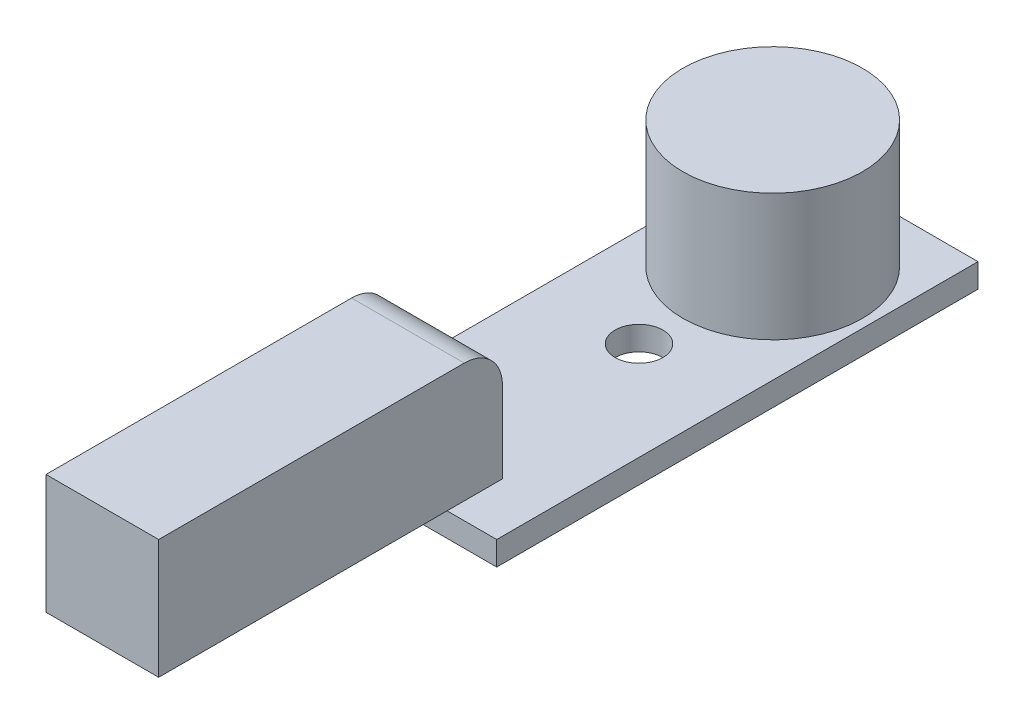
ISO-10303-21;
HEADER;
FILE_DESCRIPTION(('STEP AP214'),'2;1');
FILE_NAME('part.step','',(''),(''),'','','');
FILE_SCHEMA(('AUTOMOTIVE_DESIGN { 1 0 10303 214 1 1 1 1 }'));
ENDSEC;
DATA;
#1=APPLICATION_CONTEXT('core data for automotive mechanical design processes');
#2=APPLICATION_PROTOCOL_DEFINITION('international standard','automotive_design',2000,#1);
#3=PRODUCT_CONTEXT('',#1,'mechanical');
#4=PRODUCT('Part','Part','',(#3));
#5=PRODUCT_RELATED_PRODUCT_CATEGORY('part','',(#4));
#6=PRODUCT_DEFINITION_FORMATION('','',#4);
#7=PRODUCT_DEFINITION_CONTEXT('part definition',#1,'design');
#8=PRODUCT_DEFINITION('design','',#6,#7);
#9=PRODUCT_DEFINITION_SHAPE('','',#8);
#10=(LENGTH_UNIT() NAMED_UNIT(*) SI_UNIT(.MILLI.,.METRE.));
#11=(NAMED_UNIT(*) PLANE_ANGLE_UNIT() SI_UNIT($,.RADIAN.));
#12=(NAMED_UNIT(*) SI_UNIT($,.STERADIAN.) SOLID_ANGLE_UNIT());
#13=UNCERTAINTY_MEASURE_WITH_UNIT(LENGTH_MEASURE(1.E-05),#10,'distance_accuracy_value','');
#14=(GEOMETRIC_REPRESENTATION_CONTEXT(3) GLOBAL_UNCERTAINTY_ASSIGNED_CONTEXT((#13)) GLOBAL_UNIT_ASSIGNED_CONTEXT((#10,
#11,#12)) REPRESENTATION_CONTEXT('',''));
#15=CARTESIAN_POINT('',(0.,0.,0.));
#16=DIRECTION('',(0.,0.,1.));
#17=DIRECTION('',(1.,0.,0.));
#18=AXIS2_PLACEMENT_3D('',#15,#16,#17);
#19=CARTESIAN_POINT('',(0.,1.5875,16.002));
#20=DIRECTION('',(0.,0.,-1.));
#21=DIRECTION('',(-1.,0.,0.));
#22=AXIS2_PLACEMENT_3D('',#19,#20,#21);
#23=PLANE('',#22);
#24=DIRECTION('',(1.,0.,0.));
#25=VECTOR('',#24,1.);
#26=CARTESIAN_POINT('',(0.,0.,16.002));
#27=LINE('',#26,#25);
#28=CARTESIAN_POINT('',(-6.5405,0.,16.002));
#29=VERTEX_POINT('',#28);
#30=CARTESIAN_POINT('',(6.5405,0.,16.002));
#31=VERTEX_POINT('',#30);
#32=EDGE_CURVE('E188',#29,#31,#27,.T.);
#33=ORIENTED_EDGE('',*,*,#32,.T.);
#34=DIRECTION('',(0.,-1.,0.));
#35=VECTOR('',#34,1.);
#36=CARTESIAN_POINT('',(6.5405,1.5875,16.002));
#37=LINE('',#36,#35);
#38=CARTESIAN_POINT('',(6.5405,1.5875,16.002));
#39=VERTEX_POINT('',#38);
#40=EDGE_CURVE('E162',#39,#31,#37,.T.);
#41=ORIENTED_EDGE('',*,*,#40,.F.);
#42=DIRECTION('',(1.,0.,0.));
#43=VECTOR('',#42,1.);
#44=CARTESIAN_POINT('',(0.,1.5875,16.002));
#45=LINE('',#44,#43);
#46=CARTESIAN_POINT('',(3.23850000000001,1.5875,16.002));
#47=VERTEX_POINT('',#46);
#48=EDGE_CURVE('E169',#47,#39,#45,.T.);
#49=ORIENTED_EDGE('',*,*,#48,.F.);
#50=CARTESIAN_POINT('',(-4.2545,1.5875,16.002));
#51=VERTEX_POINT('',#50);
#52=EDGE_CURVE('E173',#51,#47,#45,.T.);
#53=ORIENTED_EDGE('',*,*,#52,.F.);
#54=CARTESIAN_POINT('',(-6.5405,1.5875,16.002));
#55=VERTEX_POINT('',#54);
#56=EDGE_CURVE('E168',#55,#51,#45,.T.);
#57=ORIENTED_EDGE('',*,*,#56,.F.);
#58=DIRECTION('',(0.,-1.,0.));
#59=VECTOR('',#58,1.);
#60=CARTESIAN_POINT('',(-6.5405,1.5875,16.002));
#61=LINE('',#60,#59);
#62=EDGE_CURVE('E187',#55,#29,#61,.T.);
#63=ORIENTED_EDGE('',*,*,#62,.T.);
#64=EDGE_LOOP('',(#33,#41,#49,#53,#57,#63));
#65=FACE_BOUND('',#64,.T.);
#66=ADVANCED_FACE('F44',(#65),#23,.F.);
#67=CARTESIAN_POINT('',(6.5405,1.5875,0.));
#68=DIRECTION('',(-1.,0.,0.));
#69=DIRECTION('',(0.,0.,1.));
#70=AXIS2_PLACEMENT_3D('',#67,#68,#69);
#71=PLANE('',#70);
#72=DIRECTION('',(0.,0.,-1.));
#73=VECTOR('',#72,1.);
#74=CARTESIAN_POINT('',(6.5405,0.,0.));
#75=LINE('',#74,#73);
#76=CARTESIAN_POINT('',(6.5405,0.,-16.002));
#77=VERTEX_POINT('',#76);
#78=EDGE_CURVE('E192',#31,#77,#75,.T.);
#79=ORIENTED_EDGE('',*,*,#78,.T.);
#80=DIRECTION('',(0.,-1.,0.));
#81=VECTOR('',#80,1.);
#82=CARTESIAN_POINT('',(6.5405,1.5875,-16.002));
#83=LINE('',#82,#81);
#84=CARTESIAN_POINT('',(6.5405,1.5875,-16.002));
#85=VERTEX_POINT('',#84);
#86=EDGE_CURVE('E209',#85,#77,#83,.T.);
#87=ORIENTED_EDGE('',*,*,#86,.F.);
#88=DIRECTION('',(0.,0.,-1.));
#89=VECTOR('',#88,1.);
#90=CARTESIAN_POINT('',(6.5405,1.5875,0.));
#91=LINE('',#90,#89);
#92=EDGE_CURVE('E171',#39,#85,#91,.T.);
#93=ORIENTED_EDGE('',*,*,#92,.F.);
#94=ORIENTED_EDGE('',*,*,#40,.T.);
#95=EDGE_LOOP('',(#79,#87,#93,#94));
#96=FACE_BOUND('',#95,.T.);
#97=ADVANCED_FACE('F238',(#96),#71,.F.);
#98=CARTESIAN_POINT('',(0.,1.5875,-16.002));
#99=DIRECTION('',(0.,0.,-1.));
#100=DIRECTION('',(-1.,0.,0.));
#101=AXIS2_PLACEMENT_3D('',#98,#99,#100);
#102=PLANE('',#101);
#103=DIRECTION('',(1.,0.,0.));
#104=VECTOR('',#103,1.);
#105=CARTESIAN_POINT('',(0.,0.,-16.002));
#106=LINE('',#105,#104);
#107=CARTESIAN_POINT('',(-6.5405,0.,-16.002));
#108=VERTEX_POINT('',#107);
#109=EDGE_CURVE('E196',#108,#77,#106,.T.);
#110=ORIENTED_EDGE('',*,*,#109,.F.);
#111=DIRECTION('',(0.,-1.,0.));
#112=VECTOR('',#111,1.);
#113=CARTESIAN_POINT('',(-6.5405,1.5875,-16.002));
#114=LINE('',#113,#112);
#115=CARTESIAN_POINT('',(-6.5405,1.5875,-16.002));
#116=VERTEX_POINT('',#115);
#117=EDGE_CURVE('E210',#116,#108,#114,.T.);
#118=ORIENTED_EDGE('',*,*,#117,.F.);
#119=DIRECTION('',(1.,0.,0.));
#120=VECTOR('',#119,1.);
#121=CARTESIAN_POINT('',(0.,1.5875,-16.002));
#122=LINE('',#121,#120);
#123=EDGE_CURVE('E176',#116,#85,#122,.T.);
#124=ORIENTED_EDGE('',*,*,#123,.T.);
#125=ORIENTED_EDGE('',*,*,#86,.T.);
#126=EDGE_LOOP('',(#110,#118,#124,#125));
#127=FACE_BOUND('',#126,.T.);
#128=ADVANCED_FACE('F253',(#127),#102,.T.);
#129=CARTESIAN_POINT('',(0.,1.5875,0.));
#130=DIRECTION('',(0.,-1.,0.));
#131=DIRECTION('',(0.,0.,-1.));
#132=AXIS2_PLACEMENT_3D('',#129,#130,#131);
#133=CYLINDRICAL_SURFACE('',#132,1.5875);
#134=CARTESIAN_POINT('',(0.,1.5875,0.));
#135=DIRECTION('',(0.,1.,0.));
#136=DIRECTION('',(0.,0.,1.));
#137=AXIS2_PLACEMENT_3D('',#134,#135,#136);
#138=CIRCLE('',#137,1.5875);
#139=CARTESIAN_POINT('',(0.,1.5875,1.5875));
#140=VERTEX_POINT('',#139);
#141=EDGE_CURVE('E163',#140,#140,#138,.T.);
#142=ORIENTED_EDGE('',*,*,#141,.T.);
#143=EDGE_LOOP('',(#142));
#144=FACE_BOUND('',#143,.T.);
#145=CARTESIAN_POINT('',(0.,0.,0.));
#146=DIRECTION('',(0.,1.,0.));
#147=DIRECTION('',(0.,0.,1.));
#148=AXIS2_PLACEMENT_3D('',#145,#146,#147);
#149=CIRCLE('',#148,1.5875);
#150=CARTESIAN_POINT('',(0.,0.,1.5875));
#151=VERTEX_POINT('',#150);
#152=EDGE_CURVE('E155',#151,#151,#149,.T.);
#153=ORIENTED_EDGE('',*,*,#152,.F.);
#154=EDGE_LOOP('',(#153));
#155=FACE_BOUND('',#154,.T.);
#156=ADVANCED_FACE('F286',(#144,#155),#133,.F.);
#157=CARTESIAN_POINT('',(-6.5405,1.5875,0.));
#158=DIRECTION('',(-1.,0.,0.));
#159=DIRECTION('',(0.,0.,1.));
#160=AXIS2_PLACEMENT_3D('',#157,#158,#159);
#161=PLANE('',#160);
#162=DIRECTION('',(0.,0.,-1.));
#163=VECTOR('',#162,1.);
#164=CARTESIAN_POINT('',(-6.5405,0.,0.));
#165=LINE('',#164,#163);
#166=EDGE_CURVE('E166',#29,#108,#165,.T.);
#167=ORIENTED_EDGE('',*,*,#166,.F.);
#168=ORIENTED_EDGE('',*,*,#62,.F.);
#169=DIRECTION('',(0.,0.,-1.));
#170=VECTOR('',#169,1.);
#171=CARTESIAN_POINT('',(-6.5405,1.5875,0.));
#172=LINE('',#171,#170);
#173=EDGE_CURVE('E185',#55,#116,#172,.T.);
#174=ORIENTED_EDGE('',*,*,#173,.T.);
#175=ORIENTED_EDGE('',*,*,#117,.T.);
#176=EDGE_LOOP('',(#167,#168,#174,#175));
#177=FACE_BOUND('',#176,.T.);
#178=ADVANCED_FACE('F250',(#177),#161,.T.);
#179=CARTESIAN_POINT('',(0.,1.5875,0.));
#180=DIRECTION('',(0.,1.,0.));
#181=DIRECTION('',(0.,0.,1.));
#182=AXIS2_PLACEMENT_3D('',#179,#180,#181);
#183=PLANE('',#182);
#184=DIRECTION('',(0.,0.,1.));
#185=VECTOR('',#184,1.);
#186=CARTESIAN_POINT('',(-4.2545,1.5875,12.319));
#187=LINE('',#186,#185);
#188=CARTESIAN_POINT('',(-4.2545,1.5875,12.319));
#189=VERTEX_POINT('',#188);
#190=EDGE_CURVE('E252',#189,#51,#187,.T.);
#191=ORIENTED_EDGE('',*,*,#190,.F.);
#192=DIRECTION('',(-1.,0.,0.));
#193=VECTOR('',#192,1.);
#194=CARTESIAN_POINT('',(-4.2545,1.5875,12.319));
#195=LINE('',#194,#193);
#196=CARTESIAN_POINT('',(3.2385,1.5875,12.319));
#197=VERTEX_POINT('',#196);
#198=EDGE_CURVE('E128',#197,#189,#195,.T.);
#199=ORIENTED_EDGE('',*,*,#198,.F.);
#200=DIRECTION('',(0.,0.,-1.));
#201=VECTOR('',#200,1.);
#202=CARTESIAN_POINT('',(3.2385,1.5875,12.319));
#203=LINE('',#202,#201);
#204=EDGE_CURVE('E165',#47,#197,#203,.T.);
#205=ORIENTED_EDGE('',*,*,#204,.F.);
#206=ORIENTED_EDGE('',*,*,#48,.T.);
#207=ORIENTED_EDGE('',*,*,#92,.T.);
#208=ORIENTED_EDGE('',*,*,#123,.F.);
#209=ORIENTED_EDGE('',*,*,#173,.F.);
#210=ORIENTED_EDGE('',*,*,#56,.T.);
#211=EDGE_LOOP('',(#191,#199,#205,#206,#207,#208,#209,#210));
#212=FACE_BOUND('',#211,.T.);
#213=CARTESIAN_POINT('',(0.,1.5875,-8.89));
#214=DIRECTION('',(0.,1.,0.));
#215=DIRECTION('',(0.,0.,1.));
#216=AXIS2_PLACEMENT_3D('',#213,#214,#215);
#217=CIRCLE('',#216,5.969);
#218=CARTESIAN_POINT('',(0.,1.5875,-2.921));
#219=VERTEX_POINT('',#218);
#220=EDGE_CURVE('E158',#219,#219,#217,.T.);
#221=ORIENTED_EDGE('',*,*,#220,.F.);
#222=EDGE_LOOP('',(#221));
#223=FACE_BOUND('',#222,.T.);
#224=ORIENTED_EDGE('',*,*,#141,.F.);
#225=EDGE_LOOP('',(#224));
#226=FACE_BOUND('',#225,.T.);
#227=ADVANCED_FACE('F233',(#212,#223,#226),#183,.T.);
#228=CARTESIAN_POINT('',(0.,0.,0.));
#229=DIRECTION('',(0.,1.,0.));
#230=DIRECTION('',(0.,0.,1.));
#231=AXIS2_PLACEMENT_3D('',#228,#229,#230);
#232=PLANE('',#231);
#233=ORIENTED_EDGE('',*,*,#152,.T.);
#234=EDGE_LOOP('',(#233));
#235=FACE_BOUND('',#234,.T.);
#236=ORIENTED_EDGE('',*,*,#32,.F.);
#237=ORIENTED_EDGE('',*,*,#166,.T.);
#238=ORIENTED_EDGE('',*,*,#109,.T.);
#239=ORIENTED_EDGE('',*,*,#78,.F.);
#240=EDGE_LOOP('',(#236,#237,#238,#239));
#241=FACE_BOUND('',#240,.T.);
#242=ADVANCED_FACE('F243',(#235,#241),#232,.F.);
#243=CARTESIAN_POINT('',(0.,10.033,-8.89));
#244=DIRECTION('',(0.,-1.,0.));
#245=DIRECTION('',(0.,0.,-1.));
#246=AXIS2_PLACEMENT_3D('',#243,#244,#245);
#247=CYLINDRICAL_SURFACE('',#246,5.969);
#248=CARTESIAN_POINT('',(0.,10.033,-8.89));
#249=DIRECTION('',(0.,1.,0.));
#250=DIRECTION('',(0.,0.,1.));
#251=AXIS2_PLACEMENT_3D('',#248,#249,#250);
#252=CIRCLE('',#251,5.969);
#253=CARTESIAN_POINT('',(0.,10.033,-2.921));
#254=VERTEX_POINT('',#253);
#255=EDGE_CURVE('E150',#254,#254,#252,.T.);
#256=ORIENTED_EDGE('',*,*,#255,.F.);
#257=EDGE_LOOP('',(#256));
#258=FACE_BOUND('',#257,.T.);
#259=ORIENTED_EDGE('',*,*,#220,.T.);
#260=EDGE_LOOP('',(#259));
#261=FACE_BOUND('',#260,.T.);
#262=ADVANCED_FACE('F303',(#258,#261),#247,.T.);
#263=CARTESIAN_POINT('',(0.,10.033,-8.89));
#264=DIRECTION('',(0.,1.,0.));
#265=DIRECTION('',(0.,0.,1.));
#266=AXIS2_PLACEMENT_3D('',#263,#264,#265);
#267=PLANE('',#266);
#268=ORIENTED_EDGE('',*,*,#255,.T.);
#269=EDGE_LOOP('',(#268));
#270=FACE_BOUND('',#269,.T.);
#271=ADVANCED_FACE('F308',(#270),#267,.T.);
#272=CARTESIAN_POINT('',(0.,1.5875,0.));
#273=DIRECTION('',(0.,1.,0.));
#274=DIRECTION('',(0.,0.,1.));
#275=AXIS2_PLACEMENT_3D('',#272,#273,#274);
#276=PLANE('',#275);
#277=CARTESIAN_POINT('',(-4.25449999999999,1.5875,35.179));
#278=VERTEX_POINT('',#277);
#279=EDGE_CURVE('E145',#51,#278,#187,.T.);
#280=ORIENTED_EDGE('',*,*,#279,.F.);
#281=ORIENTED_EDGE('',*,*,#52,.T.);
#282=CARTESIAN_POINT('',(3.23850000000001,1.5875,35.179));
#283=VERTEX_POINT('',#282);
#284=EDGE_CURVE('E224',#283,#47,#203,.T.);
#285=ORIENTED_EDGE('',*,*,#284,.F.);
#286=DIRECTION('',(1.,0.,0.));
#287=VECTOR('',#286,1.);
#288=CARTESIAN_POINT('',(-4.25449999999999,1.5875,35.179));
#289=LINE('',#288,#287);
#290=EDGE_CURVE('E257',#278,#283,#289,.T.);
#291=ORIENTED_EDGE('',*,*,#290,.F.);
#292=EDGE_LOOP('',(#280,#281,#285,#291));
#293=FACE_BOUND('',#292,.T.);
#294=ADVANCED_FACE('F258',(#293),#276,.F.);
#295=CARTESIAN_POINT('',(-4.2545,9.525,12.319));
#296=DIRECTION('',(1.,0.,0.));
#297=DIRECTION('',(0.,0.,-1.));
#298=AXIS2_PLACEMENT_3D('',#295,#296,#297);
#299=PLANE('',#298);
#300=DIRECTION('',(0.,0.,1.));
#301=VECTOR('',#300,1.);
#302=CARTESIAN_POINT('',(-4.2545,9.525,12.319));
#303=LINE('',#302,#301);
#304=CARTESIAN_POINT('',(-4.2545,9.525,14.859));
#305=VERTEX_POINT('',#304);
#306=CARTESIAN_POINT('',(-4.25449999999999,9.525,35.179));
#307=VERTEX_POINT('',#306);
#308=EDGE_CURVE('E118',#305,#307,#303,.T.);
#309=ORIENTED_EDGE('',*,*,#308,.F.);
#310=CARTESIAN_POINT('',(-4.2545,6.985,14.859));
#311=DIRECTION('',(1.,0.,0.));
#312=DIRECTION('',(0.,0.,-1.));
#313=AXIS2_PLACEMENT_3D('',#310,#311,#312);
#314=CIRCLE('',#313,2.54);
#315=CARTESIAN_POINT('',(-4.2545,6.985,12.319));
#316=VERTEX_POINT('',#315);
#317=EDGE_CURVE('E66',#305,#316,#314,.F.);
#318=ORIENTED_EDGE('',*,*,#317,.T.);
#319=DIRECTION('',(0.,-1.,0.));
#320=VECTOR('',#319,1.);
#321=CARTESIAN_POINT('',(-4.2545,9.525,12.319));
#322=LINE('',#321,#320);
#323=EDGE_CURVE('E268',#316,#189,#322,.T.);
#324=ORIENTED_EDGE('',*,*,#323,.T.);
#325=ORIENTED_EDGE('',*,*,#190,.T.);
#326=ORIENTED_EDGE('',*,*,#279,.T.);
#327=DIRECTION('',(0.,-1.,0.));
#328=VECTOR('',#327,1.);
#329=CARTESIAN_POINT('',(-4.25449999999999,9.525,35.179));
#330=LINE('',#329,#328);
#331=EDGE_CURVE('E133',#307,#278,#330,.T.);
#332=ORIENTED_EDGE('',*,*,#331,.F.);
#333=EDGE_LOOP('',(#309,#318,#324,#325,#326,#332));
#334=FACE_BOUND('',#333,.T.);
#335=ADVANCED_FACE('F142',(#334),#299,.F.);
#336=CARTESIAN_POINT('',(-4.25449999999999,9.525,35.179));
#337=DIRECTION('',(0.,0.,-1.));
#338=DIRECTION('',(-1.,0.,0.));
#339=AXIS2_PLACEMENT_3D('',#336,#337,#338);
#340=PLANE('',#339);
#341=ORIENTED_EDGE('',*,*,#290,.T.);
#342=DIRECTION('',(0.,-1.,0.));
#343=VECTOR('',#342,1.);
#344=CARTESIAN_POINT('',(3.23850000000001,9.525,35.179));
#345=LINE('',#344,#343);
#346=CARTESIAN_POINT('',(3.23850000000001,9.525,35.179));
#347=VERTEX_POINT('',#346);
#348=EDGE_CURVE('E140',#347,#283,#345,.T.);
#349=ORIENTED_EDGE('',*,*,#348,.F.);
#350=DIRECTION('',(1.,0.,0.));
#351=VECTOR('',#350,1.);
#352=CARTESIAN_POINT('',(-4.25449999999999,9.525,35.179));
#353=LINE('',#352,#351);
#354=EDGE_CURVE('E122',#307,#347,#353,.T.);
#355=ORIENTED_EDGE('',*,*,#354,.F.);
#356=ORIENTED_EDGE('',*,*,#331,.T.);
#357=EDGE_LOOP('',(#341,#349,#355,#356));
#358=FACE_BOUND('',#357,.T.);
#359=ADVANCED_FACE('F131',(#358),#340,.F.);
#360=CARTESIAN_POINT('',(3.2385,9.525,12.319));
#361=DIRECTION('',(-1.,0.,0.));
#362=DIRECTION('',(0.,0.,1.));
#363=AXIS2_PLACEMENT_3D('',#360,#361,#362);
#364=PLANE('',#363);
#365=DIRECTION('',(0.,-1.,0.));
#366=VECTOR('',#365,1.);
#367=CARTESIAN_POINT('',(3.2385,9.525,12.319));
#368=LINE('',#367,#366);
#369=CARTESIAN_POINT('',(3.2385,6.985,12.319));
#370=VERTEX_POINT('',#369);
#371=EDGE_CURVE('E152',#370,#197,#368,.T.);
#372=ORIENTED_EDGE('',*,*,#371,.F.);
#373=CARTESIAN_POINT('',(3.23850000000001,6.985,14.859));
#374=DIRECTION('',(-1.,0.,0.));
#375=DIRECTION('',(0.,0.,1.));
#376=AXIS2_PLACEMENT_3D('',#373,#374,#375);
#377=CIRCLE('',#376,2.54);
#378=CARTESIAN_POINT('',(3.23850000000001,9.525,14.859));
#379=VERTEX_POINT('',#378);
#380=EDGE_CURVE('E11',#370,#379,#377,.F.);
#381=ORIENTED_EDGE('',*,*,#380,.T.);
#382=DIRECTION('',(0.,0.,-1.));
#383=VECTOR('',#382,1.);
#384=CARTESIAN_POINT('',(3.2385,9.525,12.319));
#385=LINE('',#384,#383);
#386=EDGE_CURVE('E139',#347,#379,#385,.T.);
#387=ORIENTED_EDGE('',*,*,#386,.F.);
#388=ORIENTED_EDGE('',*,*,#348,.T.);
#389=ORIENTED_EDGE('',*,*,#284,.T.);
#390=ORIENTED_EDGE('',*,*,#204,.T.);
#391=EDGE_LOOP('',(#372,#381,#387,#388,#389,#390));
#392=FACE_BOUND('',#391,.T.);
#393=ADVANCED_FACE('F256',(#392),#364,.F.);
#394=CARTESIAN_POINT('',(-4.2545,9.525,12.319));
#395=DIRECTION('',(0.,0.,1.));
#396=DIRECTION('',(1.,0.,0.));
#397=AXIS2_PLACEMENT_3D('',#394,#395,#396);
#398=PLANE('',#397);
#399=ORIENTED_EDGE('',*,*,#323,.F.);
#400=DIRECTION('',(-1.,0.,0.));
#401=VECTOR('',#400,1.);
#402=CARTESIAN_POINT('',(3.2385,6.985,12.319));
#403=LINE('',#402,#401);
#404=EDGE_CURVE('E53',#316,#370,#403,.F.);
#405=ORIENTED_EDGE('',*,*,#404,.T.);
#406=ORIENTED_EDGE('',*,*,#371,.T.);
#407=ORIENTED_EDGE('',*,*,#198,.T.);
#408=EDGE_LOOP('',(#399,#405,#406,#407));
#409=FACE_BOUND('',#408,.T.);
#410=ADVANCED_FACE('F271',(#409),#398,.F.);
#411=CARTESIAN_POINT('',(0.,9.525,0.));
#412=DIRECTION('',(0.,1.,0.));
#413=DIRECTION('',(0.,0.,1.));
#414=AXIS2_PLACEMENT_3D('',#411,#412,#413);
#415=PLANE('',#414);
#416=ORIENTED_EDGE('',*,*,#386,.T.);
#417=DIRECTION('',(-1.,0.,0.));
#418=VECTOR('',#417,1.);
#419=CARTESIAN_POINT('',(-4.2545,9.525,14.859));
#420=LINE('',#419,#418);
#421=EDGE_CURVE('E130',#379,#305,#420,.T.);
#422=ORIENTED_EDGE('',*,*,#421,.T.);
#423=ORIENTED_EDGE('',*,*,#308,.T.);
#424=ORIENTED_EDGE('',*,*,#354,.T.);
#425=EDGE_LOOP('',(#416,#422,#423,#424));
#426=FACE_BOUND('',#425,.T.);
#427=ADVANCED_FACE('F121',(#426),#415,.T.);
#428=CARTESIAN_POINT('',(0.,6.985,14.859));
#429=DIRECTION('',(1.,0.,0.));
#430=DIRECTION('',(0.,0.,-1.));
#431=AXIS2_PLACEMENT_3D('',#428,#429,#430);
#432=CYLINDRICAL_SURFACE('',#431,2.54);
#433=ORIENTED_EDGE('',*,*,#380,.F.);
#434=ORIENTED_EDGE('',*,*,#404,.F.);
#435=ORIENTED_EDGE('',*,*,#317,.F.);
#436=ORIENTED_EDGE('',*,*,#421,.F.);
#437=EDGE_LOOP('',(#433,#434,#435,#436));
#438=FACE_BOUND('',#437,.T.);
#439=ADVANCED_FACE('F50',(#438),#432,.T.);
#440=CLOSED_SHELL('',(#66,#97,#128,#156,#178,#227,#242,#262,#271,#294,#335,#359,#393,#410,#427,#439));
#441=MANIFOLD_SOLID_BREP('B2',#440);
#442=ADVANCED_BREP_SHAPE_REPRESENTATION('',(#18,#441),#14);
#443=SHAPE_DEFINITION_REPRESENTATION(#9,#442);
ENDSEC;
END-ISO-10303-21;
